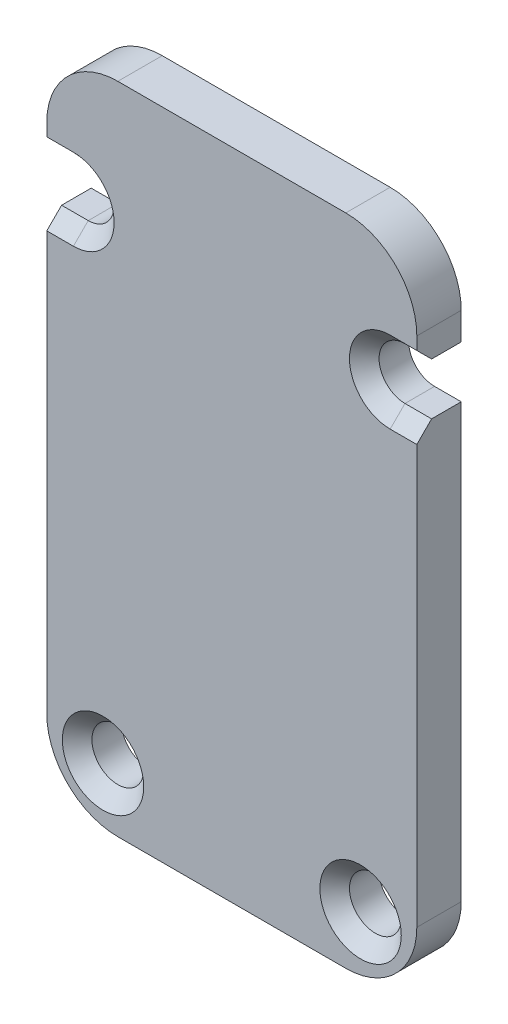
ISO-10303-21;
HEADER;
FILE_DESCRIPTION(('STEP AP214'),'2;1');
FILE_NAME('part.step','',(''),(''),'','','');
FILE_SCHEMA(('AUTOMOTIVE_DESIGN { 1 0 10303 214 1 1 1 1 }'));
ENDSEC;
DATA;
#1=APPLICATION_CONTEXT('core data for automotive mechanical design processes');
#2=APPLICATION_PROTOCOL_DEFINITION('international standard','automotive_design',2000,#1);
#3=PRODUCT_CONTEXT('',#1,'mechanical');
#4=PRODUCT('Part','Part','',(#3));
#5=PRODUCT_RELATED_PRODUCT_CATEGORY('part','',(#4));
#6=PRODUCT_DEFINITION_FORMATION('','',#4);
#7=PRODUCT_DEFINITION_CONTEXT('part definition',#1,'design');
#8=PRODUCT_DEFINITION('design','',#6,#7);
#9=PRODUCT_DEFINITION_SHAPE('','',#8);
#10=(LENGTH_UNIT() NAMED_UNIT(*) SI_UNIT(.MILLI.,.METRE.));
#11=(NAMED_UNIT(*) PLANE_ANGLE_UNIT() SI_UNIT($,.RADIAN.));
#12=(NAMED_UNIT(*) SI_UNIT($,.STERADIAN.) SOLID_ANGLE_UNIT());
#13=UNCERTAINTY_MEASURE_WITH_UNIT(LENGTH_MEASURE(1.E-05),#10,'distance_accuracy_value','');
#14=(GEOMETRIC_REPRESENTATION_CONTEXT(3) GLOBAL_UNCERTAINTY_ASSIGNED_CONTEXT((#13)) GLOBAL_UNIT_ASSIGNED_CONTEXT((#10,
#11,#12)) REPRESENTATION_CONTEXT('',''));
#15=CARTESIAN_POINT('',(0.,0.,0.));
#16=DIRECTION('',(0.,0.,1.));
#17=DIRECTION('',(1.,0.,0.));
#18=AXIS2_PLACEMENT_3D('',#15,#16,#17);
#19=CARTESIAN_POINT('',(-12.5,0.,3.));
#20=DIRECTION('',(-1.,0.,0.));
#21=DIRECTION('',(0.,0.,1.));
#22=AXIS2_PLACEMENT_3D('',#19,#20,#21);
#23=PLANE('',#22);
#24=DIRECTION('',(0.,1.,0.));
#25=VECTOR('',#24,1.);
#26=CARTESIAN_POINT('',(-12.5,0.,3.));
#27=LINE('',#26,#25);
#28=CARTESIAN_POINT('',(-12.5,-17.3,3.));
#29=VERTEX_POINT('',#28);
#30=CARTESIAN_POINT('',(-12.5,10.95,3.));
#31=VERTEX_POINT('',#30);
#32=EDGE_CURVE('E291',#29,#31,#27,.T.);
#33=ORIENTED_EDGE('',*,*,#32,.T.);
#34=DIRECTION('',(0.,0.707106781186548,-0.707106781186547));
#35=VECTOR('',#34,1.);
#36=CARTESIAN_POINT('',(-12.5,5.47499999999999,8.475));
#37=LINE('',#36,#35);
#38=CARTESIAN_POINT('',(-12.5,11.95,1.99999999999999));
#39=VERTEX_POINT('',#38);
#40=EDGE_CURVE('E255',#31,#39,#37,.T.);
#41=ORIENTED_EDGE('',*,*,#40,.T.);
#42=DIRECTION('',(0.,0.,1.));
#43=VECTOR('',#42,1.);
#44=CARTESIAN_POINT('',(-12.5,11.95,3.));
#45=LINE('',#44,#43);
#46=CARTESIAN_POINT('',(-12.5,11.95,0.));
#47=VERTEX_POINT('',#46);
#48=EDGE_CURVE('E301',#47,#39,#45,.T.);
#49=ORIENTED_EDGE('',*,*,#48,.F.);
#50=DIRECTION('',(0.,1.,0.));
#51=VECTOR('',#50,1.);
#52=CARTESIAN_POINT('',(-12.5,0.,0.));
#53=LINE('',#52,#51);
#54=CARTESIAN_POINT('',(-12.5,-17.3,0.));
#55=VERTEX_POINT('',#54);
#56=EDGE_CURVE('E313',#55,#47,#53,.T.);
#57=ORIENTED_EDGE('',*,*,#56,.F.);
#58=DIRECTION('',(0.,0.,-1.));
#59=VECTOR('',#58,1.);
#60=CARTESIAN_POINT('',(-12.5,-17.3,3.));
#61=LINE('',#60,#59);
#62=EDGE_CURVE('E335',#55,#29,#61,.F.);
#63=ORIENTED_EDGE('',*,*,#62,.T.);
#64=EDGE_LOOP('',(#33,#41,#49,#57,#63));
#65=FACE_BOUND('',#64,.T.);
#66=ADVANCED_FACE('F43',(#65),#23,.T.);
#67=CARTESIAN_POINT('',(12.5,0.,3.));
#68=DIRECTION('',(-1.,0.,0.));
#69=DIRECTION('',(0.,-1.,0.));
#70=AXIS2_PLACEMENT_3D('',#67,#68,#69);
#71=PLANE('',#70);
#72=DIRECTION('',(0.,1.,0.));
#73=VECTOR('',#72,1.);
#74=CARTESIAN_POINT('',(12.5,0.,3.));
#75=LINE('',#74,#73);
#76=CARTESIAN_POINT('',(12.5,16.45,3.));
#77=VERTEX_POINT('',#76);
#78=CARTESIAN_POINT('',(12.5,17.3,3.));
#79=VERTEX_POINT('',#78);
#80=EDGE_CURVE('E305',#77,#79,#75,.T.);
#81=ORIENTED_EDGE('',*,*,#80,.F.);
#82=DIRECTION('',(0.,-0.707106781186548,-0.707106781186547));
#83=VECTOR('',#82,1.);
#84=CARTESIAN_POINT('',(12.5,15.45,2.));
#85=LINE('',#84,#83);
#86=CARTESIAN_POINT('',(12.5,15.45,1.99999999999999));
#87=VERTEX_POINT('',#86);
#88=EDGE_CURVE('E244',#77,#87,#85,.T.);
#89=ORIENTED_EDGE('',*,*,#88,.T.);
#90=DIRECTION('',(0.,0.,-1.));
#91=VECTOR('',#90,1.);
#92=CARTESIAN_POINT('',(12.5,15.45,3.));
#93=LINE('',#92,#91);
#94=CARTESIAN_POINT('',(12.5,15.45,0.));
#95=VERTEX_POINT('',#94);
#96=EDGE_CURVE('E365',#87,#95,#93,.T.);
#97=ORIENTED_EDGE('',*,*,#96,.T.);
#98=DIRECTION('',(0.,1.,0.));
#99=VECTOR('',#98,1.);
#100=CARTESIAN_POINT('',(12.5,0.,0.));
#101=LINE('',#100,#99);
#102=CARTESIAN_POINT('',(12.5,17.3,0.));
#103=VERTEX_POINT('',#102);
#104=EDGE_CURVE('E209',#95,#103,#101,.T.);
#105=ORIENTED_EDGE('',*,*,#104,.T.);
#106=DIRECTION('',(0.,0.,-1.));
#107=VECTOR('',#106,1.);
#108=CARTESIAN_POINT('',(12.5,17.3,3.));
#109=LINE('',#108,#107);
#110=EDGE_CURVE('E344',#103,#79,#109,.F.);
#111=ORIENTED_EDGE('',*,*,#110,.T.);
#112=EDGE_LOOP('',(#81,#89,#97,#105,#111));
#113=FACE_BOUND('',#112,.T.);
#114=ADVANCED_FACE('F405',(#113),#71,.F.);
#115=DIRECTION('',(0.,0.,-1.));
#116=VECTOR('',#115,1.);
#117=CARTESIAN_POINT('',(-12.5,15.45,3.));
#118=LINE('',#117,#116);
#119=CARTESIAN_POINT('',(-12.5,15.45,1.99999999999999));
#120=VERTEX_POINT('',#119);
#121=CARTESIAN_POINT('',(-12.5,15.45,0.));
#122=VERTEX_POINT('',#121);
#123=EDGE_CURVE('E284',#120,#122,#118,.T.);
#124=ORIENTED_EDGE('',*,*,#123,.F.);
#125=DIRECTION('',(0.,0.707106781186548,0.707106781186547));
#126=VECTOR('',#125,1.);
#127=CARTESIAN_POINT('',(-12.5,8.225,-5.22500000000001));
#128=LINE('',#127,#126);
#129=CARTESIAN_POINT('',(-12.5,16.45,3.));
#130=VERTEX_POINT('',#129);
#131=EDGE_CURVE('E53',#120,#130,#128,.T.);
#132=ORIENTED_EDGE('',*,*,#131,.T.);
#133=CARTESIAN_POINT('',(-12.5,17.3,3.));
#134=VERTEX_POINT('',#133);
#135=EDGE_CURVE('E281',#130,#134,#27,.T.);
#136=ORIENTED_EDGE('',*,*,#135,.T.);
#137=DIRECTION('',(0.,0.,-1.));
#138=VECTOR('',#137,1.);
#139=CARTESIAN_POINT('',(-12.5,17.3,3.));
#140=LINE('',#139,#138);
#141=CARTESIAN_POINT('',(-12.5,17.3,0.));
#142=VERTEX_POINT('',#141);
#143=EDGE_CURVE('E333',#134,#142,#140,.T.);
#144=ORIENTED_EDGE('',*,*,#143,.T.);
#145=EDGE_CURVE('E316',#122,#142,#53,.T.);
#146=ORIENTED_EDGE('',*,*,#145,.F.);
#147=EDGE_LOOP('',(#124,#132,#136,#144,#146));
#148=FACE_BOUND('',#147,.T.);
#149=ADVANCED_FACE('F279',(#148),#23,.T.);
#150=CARTESIAN_POINT('',(0.,-22.1,3.));
#151=DIRECTION('',(0.,1.,0.));
#152=DIRECTION('',(0.,0.,1.));
#153=AXIS2_PLACEMENT_3D('',#150,#151,#152);
#154=PLANE('',#153);
#155=DIRECTION('',(1.,0.,0.));
#156=VECTOR('',#155,1.);
#157=CARTESIAN_POINT('',(0.,-22.1,3.));
#158=LINE('',#157,#156);
#159=CARTESIAN_POINT('',(-7.69999999999999,-22.1,3.));
#160=VERTEX_POINT('',#159);
#161=CARTESIAN_POINT('',(7.7,-22.1,3.));
#162=VERTEX_POINT('',#161);
#163=EDGE_CURVE('E295',#160,#162,#158,.T.);
#164=ORIENTED_EDGE('',*,*,#163,.F.);
#165=DIRECTION('',(0.,0.,-1.));
#166=VECTOR('',#165,1.);
#167=CARTESIAN_POINT('',(-7.69999999999999,-22.1,0.));
#168=LINE('',#167,#166);
#169=CARTESIAN_POINT('',(-7.69999999999999,-22.1,0.));
#170=VERTEX_POINT('',#169);
#171=EDGE_CURVE('E322',#160,#170,#168,.T.);
#172=ORIENTED_EDGE('',*,*,#171,.T.);
#173=DIRECTION('',(1.,0.,0.));
#174=VECTOR('',#173,1.);
#175=CARTESIAN_POINT('',(0.,-22.1,0.));
#176=LINE('',#175,#174);
#177=CARTESIAN_POINT('',(7.7,-22.1,0.));
#178=VERTEX_POINT('',#177);
#179=EDGE_CURVE('E315',#170,#178,#176,.T.);
#180=ORIENTED_EDGE('',*,*,#179,.T.);
#181=DIRECTION('',(0.,0.,-1.));
#182=VECTOR('',#181,1.);
#183=CARTESIAN_POINT('',(7.7,-22.1,3.));
#184=LINE('',#183,#182);
#185=EDGE_CURVE('E312',#178,#162,#184,.F.);
#186=ORIENTED_EDGE('',*,*,#185,.T.);
#187=EDGE_LOOP('',(#164,#172,#180,#186));
#188=FACE_BOUND('',#187,.T.);
#189=ADVANCED_FACE('F418',(#188),#154,.F.);
#190=DIRECTION('',(0.,0.,1.));
#191=VECTOR('',#190,1.);
#192=CARTESIAN_POINT('',(12.5,11.95,3.));
#193=LINE('',#192,#191);
#194=CARTESIAN_POINT('',(12.5,11.95,0.));
#195=VERTEX_POINT('',#194);
#196=CARTESIAN_POINT('',(12.5,11.95,1.99999999999999));
#197=VERTEX_POINT('',#196);
#198=EDGE_CURVE('E367',#195,#197,#193,.T.);
#199=ORIENTED_EDGE('',*,*,#198,.T.);
#200=DIRECTION('',(0.,-0.707106781186548,0.707106781186547));
#201=VECTOR('',#200,1.);
#202=CARTESIAN_POINT('',(12.5,11.95,2.));
#203=LINE('',#202,#201);
#204=CARTESIAN_POINT('',(12.5,10.95,3.));
#205=VERTEX_POINT('',#204);
#206=EDGE_CURVE('E248',#197,#205,#203,.T.);
#207=ORIENTED_EDGE('',*,*,#206,.T.);
#208=CARTESIAN_POINT('',(12.5,-17.3,3.));
#209=VERTEX_POINT('',#208);
#210=EDGE_CURVE('E306',#209,#205,#75,.T.);
#211=ORIENTED_EDGE('',*,*,#210,.F.);
#212=DIRECTION('',(0.,0.,-1.));
#213=VECTOR('',#212,1.);
#214=CARTESIAN_POINT('',(12.5,-17.3,3.));
#215=LINE('',#214,#213);
#216=CARTESIAN_POINT('',(12.5,-17.3,0.));
#217=VERTEX_POINT('',#216);
#218=EDGE_CURVE('E347',#209,#217,#215,.T.);
#219=ORIENTED_EDGE('',*,*,#218,.T.);
#220=EDGE_CURVE('E297',#217,#195,#101,.T.);
#221=ORIENTED_EDGE('',*,*,#220,.T.);
#222=EDGE_LOOP('',(#199,#207,#211,#219,#221));
#223=FACE_BOUND('',#222,.T.);
#224=ADVANCED_FACE('F414',(#223),#71,.F.);
#225=CARTESIAN_POINT('',(0.,22.1,3.));
#226=DIRECTION('',(0.,1.,0.));
#227=DIRECTION('',(0.,0.,1.));
#228=AXIS2_PLACEMENT_3D('',#225,#226,#227);
#229=PLANE('',#228);
#230=DIRECTION('',(1.,0.,0.));
#231=VECTOR('',#230,1.);
#232=CARTESIAN_POINT('',(0.,22.1,0.));
#233=LINE('',#232,#231);
#234=CARTESIAN_POINT('',(-7.69999999999999,22.1,0.));
#235=VERTEX_POINT('',#234);
#236=CARTESIAN_POINT('',(7.7,22.1,0.));
#237=VERTEX_POINT('',#236);
#238=EDGE_CURVE('E292',#235,#237,#233,.T.);
#239=ORIENTED_EDGE('',*,*,#238,.F.);
#240=DIRECTION('',(0.,0.,-1.));
#241=VECTOR('',#240,1.);
#242=CARTESIAN_POINT('',(-7.69999999999999,22.1,3.));
#243=LINE('',#242,#241);
#244=CARTESIAN_POINT('',(-7.69999999999999,22.1,3.));
#245=VERTEX_POINT('',#244);
#246=EDGE_CURVE('E211',#235,#245,#243,.F.);
#247=ORIENTED_EDGE('',*,*,#246,.T.);
#248=DIRECTION('',(1.,0.,0.));
#249=VECTOR('',#248,1.);
#250=CARTESIAN_POINT('',(0.,22.1,3.));
#251=LINE('',#250,#249);
#252=CARTESIAN_POINT('',(7.7,22.1,3.));
#253=VERTEX_POINT('',#252);
#254=EDGE_CURVE('E309',#245,#253,#251,.T.);
#255=ORIENTED_EDGE('',*,*,#254,.T.);
#256=DIRECTION('',(0.,0.,-1.));
#257=VECTOR('',#256,1.);
#258=CARTESIAN_POINT('',(7.7,22.1,0.));
#259=LINE('',#258,#257);
#260=EDGE_CURVE('E216',#253,#237,#259,.T.);
#261=ORIENTED_EDGE('',*,*,#260,.T.);
#262=EDGE_LOOP('',(#239,#247,#255,#261));
#263=FACE_BOUND('',#262,.T.);
#264=ADVANCED_FACE('F353',(#263),#229,.T.);
#265=CARTESIAN_POINT('',(0.,0.,3.));
#266=DIRECTION('',(0.,0.,1.));
#267=DIRECTION('',(1.,0.,0.));
#268=AXIS2_PLACEMENT_3D('',#265,#266,#267);
#269=PLANE('',#268);
#270=CARTESIAN_POINT('',(-8.7,-18.3,3.));
#271=DIRECTION('',(0.,0.,1.));
#272=DIRECTION('',(1.,0.,0.));
#273=AXIS2_PLACEMENT_3D('',#270,#271,#272);
#274=CIRCLE('',#273,2.75000000000001);
#275=CARTESIAN_POINT('',(-5.94999999999999,-18.3,3.));
#276=VERTEX_POINT('',#275);
#277=EDGE_CURVE('E237',#276,#276,#274,.F.);
#278=ORIENTED_EDGE('',*,*,#277,.T.);
#279=EDGE_LOOP('',(#278));
#280=FACE_BOUND('',#279,.T.);
#281=CARTESIAN_POINT('',(8.7,-18.3,3.));
#282=DIRECTION('',(0.,0.,1.));
#283=DIRECTION('',(1.,0.,0.));
#284=AXIS2_PLACEMENT_3D('',#281,#282,#283);
#285=CIRCLE('',#284,2.75000000000001);
#286=CARTESIAN_POINT('',(11.45,-18.3,3.));
#287=VERTEX_POINT('',#286);
#288=EDGE_CURVE('E234',#287,#287,#285,.F.);
#289=ORIENTED_EDGE('',*,*,#288,.T.);
#290=EDGE_LOOP('',(#289));
#291=FACE_BOUND('',#290,.T.);
#292=CARTESIAN_POINT('',(10.7,13.7,3.));
#293=DIRECTION('',(0.,0.,1.));
#294=DIRECTION('',(1.,0.,0.));
#295=AXIS2_PLACEMENT_3D('',#292,#293,#294);
#296=CIRCLE('',#295,2.75000000000001);
#297=CARTESIAN_POINT('',(10.7,10.95,3.));
#298=VERTEX_POINT('',#297);
#299=CARTESIAN_POINT('',(10.7,16.45,3.));
#300=VERTEX_POINT('',#299);
#301=EDGE_CURVE('E228',#298,#300,#296,.F.);
#302=ORIENTED_EDGE('',*,*,#301,.T.);
#303=DIRECTION('',(1.,0.,0.));
#304=VECTOR('',#303,1.);
#305=CARTESIAN_POINT('',(12.5,16.45,3.));
#306=LINE('',#305,#304);
#307=EDGE_CURVE('E232',#300,#77,#306,.T.);
#308=ORIENTED_EDGE('',*,*,#307,.T.);
#309=ORIENTED_EDGE('',*,*,#80,.T.);
#310=CARTESIAN_POINT('',(7.7,17.3,3.));
#311=DIRECTION('',(0.,0.,1.));
#312=DIRECTION('',(1.,0.,0.));
#313=AXIS2_PLACEMENT_3D('',#310,#311,#312);
#314=CIRCLE('',#313,4.8);
#315=EDGE_CURVE('E337',#79,#253,#314,.T.);
#316=ORIENTED_EDGE('',*,*,#315,.T.);
#317=ORIENTED_EDGE('',*,*,#254,.F.);
#318=CARTESIAN_POINT('',(-7.69999999999999,17.3,3.));
#319=DIRECTION('',(0.,0.,1.));
#320=DIRECTION('',(1.,0.,0.));
#321=AXIS2_PLACEMENT_3D('',#318,#319,#320);
#322=CIRCLE('',#321,4.8);
#323=EDGE_CURVE('E289',#245,#134,#322,.T.);
#324=ORIENTED_EDGE('',*,*,#323,.T.);
#325=ORIENTED_EDGE('',*,*,#135,.F.);
#326=DIRECTION('',(1.,0.,0.));
#327=VECTOR('',#326,1.);
#328=CARTESIAN_POINT('',(-10.7,16.45,3.));
#329=LINE('',#328,#327);
#330=CARTESIAN_POINT('',(-10.7,16.45,3.));
#331=VERTEX_POINT('',#330);
#332=EDGE_CURVE('E224',#130,#331,#329,.T.);
#333=ORIENTED_EDGE('',*,*,#332,.T.);
#334=CARTESIAN_POINT('',(-10.7,13.7,3.));
#335=DIRECTION('',(0.,0.,1.));
#336=DIRECTION('',(1.,0.,0.));
#337=AXIS2_PLACEMENT_3D('',#334,#335,#336);
#338=CIRCLE('',#337,2.75000000000001);
#339=CARTESIAN_POINT('',(-10.7,10.95,3.));
#340=VERTEX_POINT('',#339);
#341=EDGE_CURVE('E222',#331,#340,#338,.F.);
#342=ORIENTED_EDGE('',*,*,#341,.T.);
#343=DIRECTION('',(-1.,0.,0.));
#344=VECTOR('',#343,1.);
#345=CARTESIAN_POINT('',(-12.5,10.95,3.));
#346=LINE('',#345,#344);
#347=EDGE_CURVE('E226',#340,#31,#346,.T.);
#348=ORIENTED_EDGE('',*,*,#347,.T.);
#349=ORIENTED_EDGE('',*,*,#32,.F.);
#350=CARTESIAN_POINT('',(-7.69999999999999,-17.3,3.));
#351=DIRECTION('',(0.,0.,1.));
#352=DIRECTION('',(1.,0.,0.));
#353=AXIS2_PLACEMENT_3D('',#350,#351,#352);
#354=CIRCLE('',#353,4.8);
#355=EDGE_CURVE('E342',#29,#160,#354,.T.);
#356=ORIENTED_EDGE('',*,*,#355,.T.);
#357=ORIENTED_EDGE('',*,*,#163,.T.);
#358=CARTESIAN_POINT('',(7.7,-17.3,3.));
#359=DIRECTION('',(0.,0.,1.));
#360=DIRECTION('',(1.,0.,0.));
#361=AXIS2_PLACEMENT_3D('',#358,#359,#360);
#362=CIRCLE('',#361,4.8);
#363=EDGE_CURVE('E340',#162,#209,#362,.T.);
#364=ORIENTED_EDGE('',*,*,#363,.T.);
#365=ORIENTED_EDGE('',*,*,#210,.T.);
#366=DIRECTION('',(-1.,0.,0.));
#367=VECTOR('',#366,1.);
#368=CARTESIAN_POINT('',(10.7,10.95,3.));
#369=LINE('',#368,#367);
#370=EDGE_CURVE('E230',#205,#298,#369,.T.);
#371=ORIENTED_EDGE('',*,*,#370,.T.);
#372=EDGE_LOOP('',(#302,#308,#309,#316,#317,#324,#325,#333,#342,#348,#349,#356,#357,#364,#365,#371));
#373=FACE_BOUND('',#372,.T.);
#374=ADVANCED_FACE('F286',(#280,#291,#373),#269,.T.);
#375=CARTESIAN_POINT('',(0.,0.,0.));
#376=DIRECTION('',(0.,0.,1.));
#377=DIRECTION('',(1.,0.,0.));
#378=AXIS2_PLACEMENT_3D('',#375,#376,#377);
#379=PLANE('',#378);
#380=ORIENTED_EDGE('',*,*,#56,.T.);
#381=DIRECTION('',(1.,0.,0.));
#382=VECTOR('',#381,1.);
#383=CARTESIAN_POINT('',(0.,11.95,0.));
#384=LINE('',#383,#382);
#385=CARTESIAN_POINT('',(-10.7,11.95,0.));
#386=VERTEX_POINT('',#385);
#387=EDGE_CURVE('E210',#47,#386,#384,.T.);
#388=ORIENTED_EDGE('',*,*,#387,.T.);
#389=CARTESIAN_POINT('',(-10.7,13.7,0.));
#390=DIRECTION('',(0.,0.,1.));
#391=DIRECTION('',(1.,0.,0.));
#392=AXIS2_PLACEMENT_3D('',#389,#390,#391);
#393=CIRCLE('',#392,1.75);
#394=CARTESIAN_POINT('',(-10.7,15.45,0.));
#395=VERTEX_POINT('',#394);
#396=EDGE_CURVE('E263',#386,#395,#393,.T.);
#397=ORIENTED_EDGE('',*,*,#396,.T.);
#398=DIRECTION('',(-1.,0.,0.));
#399=VECTOR('',#398,1.);
#400=CARTESIAN_POINT('',(0.,15.45,0.));
#401=LINE('',#400,#399);
#402=EDGE_CURVE('E378',#395,#122,#401,.T.);
#403=ORIENTED_EDGE('',*,*,#402,.T.);
#404=ORIENTED_EDGE('',*,*,#145,.T.);
#405=CARTESIAN_POINT('',(-7.69999999999999,17.3,0.));
#406=DIRECTION('',(0.,0.,1.));
#407=DIRECTION('',(1.,0.,0.));
#408=AXIS2_PLACEMENT_3D('',#405,#406,#407);
#409=CIRCLE('',#408,4.8);
#410=EDGE_CURVE('E327',#142,#235,#409,.F.);
#411=ORIENTED_EDGE('',*,*,#410,.T.);
#412=ORIENTED_EDGE('',*,*,#238,.T.);
#413=CARTESIAN_POINT('',(7.7,17.3,0.));
#414=DIRECTION('',(0.,0.,1.));
#415=DIRECTION('',(1.,0.,0.));
#416=AXIS2_PLACEMENT_3D('',#413,#414,#415);
#417=CIRCLE('',#416,4.8);
#418=EDGE_CURVE('E325',#237,#103,#417,.F.);
#419=ORIENTED_EDGE('',*,*,#418,.T.);
#420=ORIENTED_EDGE('',*,*,#104,.F.);
#421=DIRECTION('',(-1.,0.,0.));
#422=VECTOR('',#421,1.);
#423=CARTESIAN_POINT('',(0.,15.45,0.));
#424=LINE('',#423,#422);
#425=CARTESIAN_POINT('',(10.7,15.45,0.));
#426=VERTEX_POINT('',#425);
#427=EDGE_CURVE('E188',#95,#426,#424,.T.);
#428=ORIENTED_EDGE('',*,*,#427,.T.);
#429=CARTESIAN_POINT('',(10.7,13.7,0.));
#430=DIRECTION('',(0.,0.,1.));
#431=DIRECTION('',(1.,0.,0.));
#432=AXIS2_PLACEMENT_3D('',#429,#430,#431);
#433=CIRCLE('',#432,1.75);
#434=CARTESIAN_POINT('',(10.7,11.95,0.));
#435=VERTEX_POINT('',#434);
#436=EDGE_CURVE('E198',#426,#435,#433,.T.);
#437=ORIENTED_EDGE('',*,*,#436,.T.);
#438=DIRECTION('',(1.,0.,0.));
#439=VECTOR('',#438,1.);
#440=CARTESIAN_POINT('',(0.,11.95,0.));
#441=LINE('',#440,#439);
#442=EDGE_CURVE('E194',#435,#195,#441,.T.);
#443=ORIENTED_EDGE('',*,*,#442,.T.);
#444=ORIENTED_EDGE('',*,*,#220,.F.);
#445=CARTESIAN_POINT('',(7.7,-17.3,0.));
#446=DIRECTION('',(0.,0.,1.));
#447=DIRECTION('',(1.,0.,0.));
#448=AXIS2_PLACEMENT_3D('',#445,#446,#447);
#449=CIRCLE('',#448,4.8);
#450=EDGE_CURVE('E329',#217,#178,#449,.F.);
#451=ORIENTED_EDGE('',*,*,#450,.T.);
#452=ORIENTED_EDGE('',*,*,#179,.F.);
#453=CARTESIAN_POINT('',(-7.69999999999999,-17.3,0.));
#454=DIRECTION('',(0.,0.,1.));
#455=DIRECTION('',(1.,0.,0.));
#456=AXIS2_PLACEMENT_3D('',#453,#454,#455);
#457=CIRCLE('',#456,4.8);
#458=EDGE_CURVE('E331',#170,#55,#457,.F.);
#459=ORIENTED_EDGE('',*,*,#458,.T.);
#460=EDGE_LOOP('',(#380,#388,#397,#403,#404,#411,#412,#419,#420,#428,#437,#443,#444,#451,#452,#459));
#461=FACE_BOUND('',#460,.T.);
#462=CARTESIAN_POINT('',(8.7,-18.3,0.));
#463=DIRECTION('',(0.,0.,1.));
#464=DIRECTION('',(1.,0.,0.));
#465=AXIS2_PLACEMENT_3D('',#462,#463,#464);
#466=CIRCLE('',#465,1.75);
#467=CARTESIAN_POINT('',(10.45,-18.3,0.));
#468=VERTEX_POINT('',#467);
#469=EDGE_CURVE('E375',#468,#468,#466,.T.);
#470=ORIENTED_EDGE('',*,*,#469,.T.);
#471=EDGE_LOOP('',(#470));
#472=FACE_BOUND('',#471,.T.);
#473=CARTESIAN_POINT('',(-8.7,-18.3,0.));
#474=DIRECTION('',(0.,0.,1.));
#475=DIRECTION('',(1.,0.,0.));
#476=AXIS2_PLACEMENT_3D('',#473,#474,#475);
#477=CIRCLE('',#476,1.75);
#478=CARTESIAN_POINT('',(-6.95,-18.3,0.));
#479=VERTEX_POINT('',#478);
#480=EDGE_CURVE('E372',#479,#479,#477,.T.);
#481=ORIENTED_EDGE('',*,*,#480,.T.);
#482=EDGE_LOOP('',(#481));
#483=FACE_BOUND('',#482,.T.);
#484=ADVANCED_FACE('F206',(#461,#472,#483),#379,.F.);
#485=CARTESIAN_POINT('',(-7.69999999999999,-17.3,3.));
#486=DIRECTION('',(0.,0.,1.));
#487=DIRECTION('',(1.,0.,0.));
#488=AXIS2_PLACEMENT_3D('',#485,#486,#487);
#489=CYLINDRICAL_SURFACE('',#488,4.8);
#490=ORIENTED_EDGE('',*,*,#355,.F.);
#491=ORIENTED_EDGE('',*,*,#62,.F.);
#492=ORIENTED_EDGE('',*,*,#458,.F.);
#493=ORIENTED_EDGE('',*,*,#171,.F.);
#494=EDGE_LOOP('',(#490,#491,#492,#493));
#495=FACE_BOUND('',#494,.T.);
#496=ADVANCED_FACE('F432',(#495),#489,.T.);
#497=CARTESIAN_POINT('',(7.7,-17.3,3.));
#498=DIRECTION('',(0.,0.,-1.));
#499=DIRECTION('',(-1.,0.,0.));
#500=AXIS2_PLACEMENT_3D('',#497,#498,#499);
#501=CYLINDRICAL_SURFACE('',#500,4.8);
#502=ORIENTED_EDGE('',*,*,#363,.F.);
#503=ORIENTED_EDGE('',*,*,#185,.F.);
#504=ORIENTED_EDGE('',*,*,#450,.F.);
#505=ORIENTED_EDGE('',*,*,#218,.F.);
#506=EDGE_LOOP('',(#502,#503,#504,#505));
#507=FACE_BOUND('',#506,.T.);
#508=ADVANCED_FACE('F472',(#507),#501,.T.);
#509=CARTESIAN_POINT('',(-7.69999999999999,17.3,3.));
#510=DIRECTION('',(0.,0.,-1.));
#511=DIRECTION('',(-1.,0.,0.));
#512=AXIS2_PLACEMENT_3D('',#509,#510,#511);
#513=CYLINDRICAL_SURFACE('',#512,4.8);
#514=ORIENTED_EDGE('',*,*,#323,.F.);
#515=ORIENTED_EDGE('',*,*,#246,.F.);
#516=ORIENTED_EDGE('',*,*,#410,.F.);
#517=ORIENTED_EDGE('',*,*,#143,.F.);
#518=EDGE_LOOP('',(#514,#515,#516,#517));
#519=FACE_BOUND('',#518,.T.);
#520=ADVANCED_FACE('F361',(#519),#513,.T.);
#521=CARTESIAN_POINT('',(7.7,17.3,3.));
#522=DIRECTION('',(0.,0.,1.));
#523=DIRECTION('',(1.,0.,0.));
#524=AXIS2_PLACEMENT_3D('',#521,#522,#523);
#525=CYLINDRICAL_SURFACE('',#524,4.8);
#526=ORIENTED_EDGE('',*,*,#315,.F.);
#527=ORIENTED_EDGE('',*,*,#110,.F.);
#528=ORIENTED_EDGE('',*,*,#418,.F.);
#529=ORIENTED_EDGE('',*,*,#260,.F.);
#530=EDGE_LOOP('',(#526,#527,#528,#529));
#531=FACE_BOUND('',#530,.T.);
#532=ADVANCED_FACE('F400',(#531),#525,.T.);
#533=CARTESIAN_POINT('',(-8.7,-18.3,0.));
#534=DIRECTION('',(0.,0.,1.));
#535=DIRECTION('',(1.,0.,0.));
#536=AXIS2_PLACEMENT_3D('',#533,#534,#535);
#537=CYLINDRICAL_SURFACE('',#536,1.75);
#538=CARTESIAN_POINT('',(-8.7,-18.3,1.99999999999999));
#539=DIRECTION('',(0.,0.,1.));
#540=DIRECTION('',(1.,0.,0.));
#541=AXIS2_PLACEMENT_3D('',#538,#539,#540);
#542=CIRCLE('',#541,1.75);
#543=CARTESIAN_POINT('',(-6.95,-18.3,1.99999999999999));
#544=VERTEX_POINT('',#543);
#545=EDGE_CURVE('E214',#544,#544,#542,.T.);
#546=ORIENTED_EDGE('',*,*,#545,.T.);
#547=EDGE_LOOP('',(#546));
#548=FACE_BOUND('',#547,.T.);
#549=ORIENTED_EDGE('',*,*,#480,.F.);
#550=EDGE_LOOP('',(#549));
#551=FACE_BOUND('',#550,.T.);
#552=ADVANCED_FACE('F391',(#548,#551),#537,.F.);
#553=CARTESIAN_POINT('',(8.7,-18.3,0.));
#554=DIRECTION('',(0.,0.,1.));
#555=DIRECTION('',(1.,0.,0.));
#556=AXIS2_PLACEMENT_3D('',#553,#554,#555);
#557=CYLINDRICAL_SURFACE('',#556,1.75);
#558=CARTESIAN_POINT('',(8.7,-18.3,1.99999999999999));
#559=DIRECTION('',(0.,0.,1.));
#560=DIRECTION('',(1.,0.,0.));
#561=AXIS2_PLACEMENT_3D('',#558,#559,#560);
#562=CIRCLE('',#561,1.75);
#563=CARTESIAN_POINT('',(10.45,-18.3,1.99999999999999));
#564=VERTEX_POINT('',#563);
#565=EDGE_CURVE('E240',#564,#564,#562,.T.);
#566=ORIENTED_EDGE('',*,*,#565,.T.);
#567=EDGE_LOOP('',(#566));
#568=FACE_BOUND('',#567,.T.);
#569=ORIENTED_EDGE('',*,*,#469,.F.);
#570=EDGE_LOOP('',(#569));
#571=FACE_BOUND('',#570,.T.);
#572=ADVANCED_FACE('F389',(#568,#571),#557,.F.);
#573=CARTESIAN_POINT('',(0.,15.45,0.));
#574=DIRECTION('',(0.,1.,0.));
#575=DIRECTION('',(-1.,0.,0.));
#576=AXIS2_PLACEMENT_3D('',#573,#574,#575);
#577=PLANE('',#576);
#578=ORIENTED_EDGE('',*,*,#96,.F.);
#579=DIRECTION('',(-1.,0.,0.));
#580=VECTOR('',#579,1.);
#581=CARTESIAN_POINT('',(10.7,15.45,1.99999999999999));
#582=LINE('',#581,#580);
#583=CARTESIAN_POINT('',(10.7,15.45,1.99999999999999));
#584=VERTEX_POINT('',#583);
#585=EDGE_CURVE('E191',#87,#584,#582,.T.);
#586=ORIENTED_EDGE('',*,*,#585,.T.);
#587=DIRECTION('',(0.,0.,1.));
#588=VECTOR('',#587,1.);
#589=CARTESIAN_POINT('',(10.7,15.45,0.));
#590=LINE('',#589,#588);
#591=EDGE_CURVE('E183',#426,#584,#590,.T.);
#592=ORIENTED_EDGE('',*,*,#591,.F.);
#593=ORIENTED_EDGE('',*,*,#427,.F.);
#594=EDGE_LOOP('',(#578,#586,#592,#593));
#595=FACE_BOUND('',#594,.T.);
#596=ADVANCED_FACE('F186',(#595),#577,.F.);
#597=CARTESIAN_POINT('',(0.,11.95,0.));
#598=DIRECTION('',(0.,-1.,0.));
#599=DIRECTION('',(1.,0.,0.));
#600=AXIS2_PLACEMENT_3D('',#597,#598,#599);
#601=PLANE('',#600);
#602=DIRECTION('',(0.,0.,1.));
#603=VECTOR('',#602,1.);
#604=CARTESIAN_POINT('',(10.7,11.95,0.));
#605=LINE('',#604,#603);
#606=CARTESIAN_POINT('',(10.7,11.95,1.99999999999999));
#607=VERTEX_POINT('',#606);
#608=EDGE_CURVE('E193',#435,#607,#605,.T.);
#609=ORIENTED_EDGE('',*,*,#608,.T.);
#610=DIRECTION('',(1.,0.,0.));
#611=VECTOR('',#610,1.);
#612=CARTESIAN_POINT('',(12.5,11.95,1.99999999999999));
#613=LINE('',#612,#611);
#614=EDGE_CURVE('E246',#607,#197,#613,.T.);
#615=ORIENTED_EDGE('',*,*,#614,.T.);
#616=ORIENTED_EDGE('',*,*,#198,.F.);
#617=ORIENTED_EDGE('',*,*,#442,.F.);
#618=EDGE_LOOP('',(#609,#615,#616,#617));
#619=FACE_BOUND('',#618,.T.);
#620=ADVANCED_FACE('F398',(#619),#601,.F.);
#621=CARTESIAN_POINT('',(10.7,13.7,0.));
#622=DIRECTION('',(0.,0.,1.));
#623=DIRECTION('',(1.,0.,0.));
#624=AXIS2_PLACEMENT_3D('',#621,#622,#623);
#625=CYLINDRICAL_SURFACE('',#624,1.75);
#626=ORIENTED_EDGE('',*,*,#591,.T.);
#627=CARTESIAN_POINT('',(10.7,13.7,1.99999999999999));
#628=DIRECTION('',(0.,0.,1.));
#629=DIRECTION('',(1.,0.,0.));
#630=AXIS2_PLACEMENT_3D('',#627,#628,#629);
#631=CIRCLE('',#630,1.75);
#632=EDGE_CURVE('E250',#584,#607,#631,.T.);
#633=ORIENTED_EDGE('',*,*,#632,.T.);
#634=ORIENTED_EDGE('',*,*,#608,.F.);
#635=ORIENTED_EDGE('',*,*,#436,.F.);
#636=EDGE_LOOP('',(#626,#633,#634,#635));
#637=FACE_BOUND('',#636,.T.);
#638=ADVANCED_FACE('F199',(#637),#625,.F.);
#639=CARTESIAN_POINT('',(-10.7,13.7,0.));
#640=DIRECTION('',(0.,0.,1.));
#641=DIRECTION('',(1.,0.,0.));
#642=AXIS2_PLACEMENT_3D('',#639,#640,#641);
#643=CYLINDRICAL_SURFACE('',#642,1.75);
#644=DIRECTION('',(0.,0.,1.));
#645=VECTOR('',#644,1.);
#646=CARTESIAN_POINT('',(-10.7,11.95,0.));
#647=LINE('',#646,#645);
#648=CARTESIAN_POINT('',(-10.7,11.95,1.99999999999999));
#649=VERTEX_POINT('',#648);
#650=EDGE_CURVE('E203',#386,#649,#647,.T.);
#651=ORIENTED_EDGE('',*,*,#650,.T.);
#652=CARTESIAN_POINT('',(-10.7,13.7,1.99999999999999));
#653=DIRECTION('',(0.,0.,1.));
#654=DIRECTION('',(1.,0.,0.));
#655=AXIS2_PLACEMENT_3D('',#652,#653,#654);
#656=CIRCLE('',#655,1.75);
#657=CARTESIAN_POINT('',(-10.7,15.45,1.99999999999999));
#658=VERTEX_POINT('',#657);
#659=EDGE_CURVE('E11',#649,#658,#656,.T.);
#660=ORIENTED_EDGE('',*,*,#659,.T.);
#661=DIRECTION('',(0.,0.,1.));
#662=VECTOR('',#661,1.);
#663=CARTESIAN_POINT('',(-10.7,15.45,0.));
#664=LINE('',#663,#662);
#665=EDGE_CURVE('E376',#395,#658,#664,.T.);
#666=ORIENTED_EDGE('',*,*,#665,.F.);
#667=ORIENTED_EDGE('',*,*,#396,.F.);
#668=EDGE_LOOP('',(#651,#660,#666,#667));
#669=FACE_BOUND('',#668,.T.);
#670=ADVANCED_FACE('F436',(#669),#643,.F.);
#671=CARTESIAN_POINT('',(0.,11.95,0.));
#672=DIRECTION('',(0.,-1.,0.));
#673=DIRECTION('',(0.,0.,-1.));
#674=AXIS2_PLACEMENT_3D('',#671,#672,#673);
#675=PLANE('',#674);
#676=ORIENTED_EDGE('',*,*,#48,.T.);
#677=DIRECTION('',(1.,0.,0.));
#678=VECTOR('',#677,1.);
#679=CARTESIAN_POINT('',(-10.7,11.95,1.99999999999999));
#680=LINE('',#679,#678);
#681=EDGE_CURVE('E252',#39,#649,#680,.T.);
#682=ORIENTED_EDGE('',*,*,#681,.T.);
#683=ORIENTED_EDGE('',*,*,#650,.F.);
#684=ORIENTED_EDGE('',*,*,#387,.F.);
#685=EDGE_LOOP('',(#676,#682,#683,#684));
#686=FACE_BOUND('',#685,.T.);
#687=ADVANCED_FACE('F439',(#686),#675,.F.);
#688=CARTESIAN_POINT('',(0.,15.45,0.));
#689=DIRECTION('',(0.,1.,0.));
#690=DIRECTION('',(0.,0.,1.));
#691=AXIS2_PLACEMENT_3D('',#688,#689,#690);
#692=PLANE('',#691);
#693=ORIENTED_EDGE('',*,*,#665,.T.);
#694=DIRECTION('',(-1.,0.,0.));
#695=VECTOR('',#694,1.);
#696=CARTESIAN_POINT('',(-12.5,15.45,1.99999999999999));
#697=LINE('',#696,#695);
#698=EDGE_CURVE('E66',#658,#120,#697,.T.);
#699=ORIENTED_EDGE('',*,*,#698,.T.);
#700=ORIENTED_EDGE('',*,*,#123,.T.);
#701=ORIENTED_EDGE('',*,*,#402,.F.);
#702=EDGE_LOOP('',(#693,#699,#700,#701));
#703=FACE_BOUND('',#702,.T.);
#704=ADVANCED_FACE('F440',(#703),#692,.F.);
#705=CARTESIAN_POINT('',(-8.7,-18.3,1.99999999999999));
#706=DIRECTION('',(0.,0.,1.));
#707=DIRECTION('',(1.,0.,0.));
#708=AXIS2_PLACEMENT_3D('',#705,#706,#707);
#709=CONICAL_SURFACE('',#708,1.75,0.785398163397449);
#710=ORIENTED_EDGE('',*,*,#277,.F.);
#711=EDGE_LOOP('',(#710));
#712=FACE_BOUND('',#711,.T.);
#713=ORIENTED_EDGE('',*,*,#545,.F.);
#714=EDGE_LOOP('',(#713));
#715=FACE_BOUND('',#714,.T.);
#716=ADVANCED_FACE('F443',(#712,#715),#709,.F.);
#717=CARTESIAN_POINT('',(8.7,-18.3,1.99999999999999));
#718=DIRECTION('',(0.,0.,1.));
#719=DIRECTION('',(1.,0.,0.));
#720=AXIS2_PLACEMENT_3D('',#717,#718,#719);
#721=CONICAL_SURFACE('',#720,1.75,0.785398163397449);
#722=ORIENTED_EDGE('',*,*,#288,.F.);
#723=EDGE_LOOP('',(#722));
#724=FACE_BOUND('',#723,.T.);
#725=ORIENTED_EDGE('',*,*,#565,.F.);
#726=EDGE_LOOP('',(#725));
#727=FACE_BOUND('',#726,.T.);
#728=ADVANCED_FACE('F482',(#724,#727),#721,.F.);
#729=CARTESIAN_POINT('',(0.,11.95,1.99999999999999));
#730=DIRECTION('',(0.,0.707106781186547,0.707106781186548));
#731=DIRECTION('',(-1.,0.,0.));
#732=AXIS2_PLACEMENT_3D('',#729,#730,#731);
#733=PLANE('',#732);
#734=ORIENTED_EDGE('',*,*,#206,.F.);
#735=ORIENTED_EDGE('',*,*,#614,.F.);
#736=DIRECTION('',(0.,0.707106781186548,-0.707106781186547));
#737=VECTOR('',#736,1.);
#738=CARTESIAN_POINT('',(10.7,10.95,3.));
#739=LINE('',#738,#737);
#740=EDGE_CURVE('E261',#298,#607,#739,.T.);
#741=ORIENTED_EDGE('',*,*,#740,.F.);
#742=ORIENTED_EDGE('',*,*,#370,.F.);
#743=EDGE_LOOP('',(#734,#735,#741,#742));
#744=FACE_BOUND('',#743,.T.);
#745=ADVANCED_FACE('F455',(#744),#733,.T.);
#746=CARTESIAN_POINT('',(10.7,13.7,1.99999999999999));
#747=DIRECTION('',(0.,0.,1.));
#748=DIRECTION('',(1.,0.,0.));
#749=AXIS2_PLACEMENT_3D('',#746,#747,#748);
#750=CONICAL_SURFACE('',#749,1.75,0.785398163397449);
#751=ORIENTED_EDGE('',*,*,#740,.T.);
#752=ORIENTED_EDGE('',*,*,#632,.F.);
#753=DIRECTION('',(0.,-0.707106781186548,-0.707106781186547));
#754=VECTOR('',#753,1.);
#755=CARTESIAN_POINT('',(10.7,16.45,3.));
#756=LINE('',#755,#754);
#757=EDGE_CURVE('E259',#300,#584,#756,.T.);
#758=ORIENTED_EDGE('',*,*,#757,.F.);
#759=ORIENTED_EDGE('',*,*,#301,.F.);
#760=EDGE_LOOP('',(#751,#752,#758,#759));
#761=FACE_BOUND('',#760,.T.);
#762=ADVANCED_FACE('F460',(#761),#750,.F.);
#763=CARTESIAN_POINT('',(0.,15.45,1.99999999999999));
#764=DIRECTION('',(0.,-0.707106781186547,0.707106781186548));
#765=DIRECTION('',(1.,0.,0.));
#766=AXIS2_PLACEMENT_3D('',#763,#764,#765);
#767=PLANE('',#766);
#768=ORIENTED_EDGE('',*,*,#88,.F.);
#769=ORIENTED_EDGE('',*,*,#307,.F.);
#770=ORIENTED_EDGE('',*,*,#757,.T.);
#771=ORIENTED_EDGE('',*,*,#585,.F.);
#772=EDGE_LOOP('',(#768,#769,#770,#771));
#773=FACE_BOUND('',#772,.T.);
#774=ADVANCED_FACE('F466',(#773),#767,.T.);
#775=CARTESIAN_POINT('',(0.,15.45,1.99999999999999));
#776=DIRECTION('',(0.,-0.707106781186547,0.707106781186548));
#777=DIRECTION('',(1.,0.,0.));
#778=AXIS2_PLACEMENT_3D('',#775,#776,#777);
#779=PLANE('',#778);
#780=ORIENTED_EDGE('',*,*,#131,.F.);
#781=ORIENTED_EDGE('',*,*,#698,.F.);
#782=DIRECTION('',(0.,-0.707106781186548,-0.707106781186547));
#783=VECTOR('',#782,1.);
#784=CARTESIAN_POINT('',(-10.7,16.45,3.));
#785=LINE('',#784,#783);
#786=EDGE_CURVE('E48',#331,#658,#785,.T.);
#787=ORIENTED_EDGE('',*,*,#786,.F.);
#788=ORIENTED_EDGE('',*,*,#332,.F.);
#789=EDGE_LOOP('',(#780,#781,#787,#788));
#790=FACE_BOUND('',#789,.T.);
#791=ADVANCED_FACE('F46',(#790),#779,.T.);
#792=CARTESIAN_POINT('',(-10.7,13.7,1.99999999999999));
#793=DIRECTION('',(0.,0.,1.));
#794=DIRECTION('',(1.,0.,0.));
#795=AXIS2_PLACEMENT_3D('',#792,#793,#794);
#796=CONICAL_SURFACE('',#795,1.75,0.785398163397449);
#797=ORIENTED_EDGE('',*,*,#786,.T.);
#798=ORIENTED_EDGE('',*,*,#659,.F.);
#799=DIRECTION('',(0.,0.707106781186548,-0.707106781186547));
#800=VECTOR('',#799,1.);
#801=CARTESIAN_POINT('',(-10.7,10.95,3.));
#802=LINE('',#801,#800);
#803=EDGE_CURVE('E264',#340,#649,#802,.T.);
#804=ORIENTED_EDGE('',*,*,#803,.F.);
#805=ORIENTED_EDGE('',*,*,#341,.F.);
#806=EDGE_LOOP('',(#797,#798,#804,#805));
#807=FACE_BOUND('',#806,.T.);
#808=ADVANCED_FACE('F273',(#807),#796,.F.);
#809=CARTESIAN_POINT('',(0.,11.95,1.99999999999999));
#810=DIRECTION('',(0.,0.707106781186547,0.707106781186548));
#811=DIRECTION('',(-1.,0.,0.));
#812=AXIS2_PLACEMENT_3D('',#809,#810,#811);
#813=PLANE('',#812);
#814=ORIENTED_EDGE('',*,*,#40,.F.);
#815=ORIENTED_EDGE('',*,*,#347,.F.);
#816=ORIENTED_EDGE('',*,*,#803,.T.);
#817=ORIENTED_EDGE('',*,*,#681,.F.);
#818=EDGE_LOOP('',(#814,#815,#816,#817));
#819=FACE_BOUND('',#818,.T.);
#820=ADVANCED_FACE('F505',(#819),#813,.T.);
#821=CLOSED_SHELL('',(#66,#114,#149,#189,#224,#264,#374,#484,#496,#508,#520,#532,#552,#572,#596,
#620,#638,#670,#687,#704,#716,#728,#745,#762,#774,#791,#808,#820));
#822=MANIFOLD_SOLID_BREP('B2',#821);
#823=ADVANCED_BREP_SHAPE_REPRESENTATION('',(#18,#822),#14);
#824=SHAPE_DEFINITION_REPRESENTATION(#9,#823);
ENDSEC;
END-ISO-10303-21;
